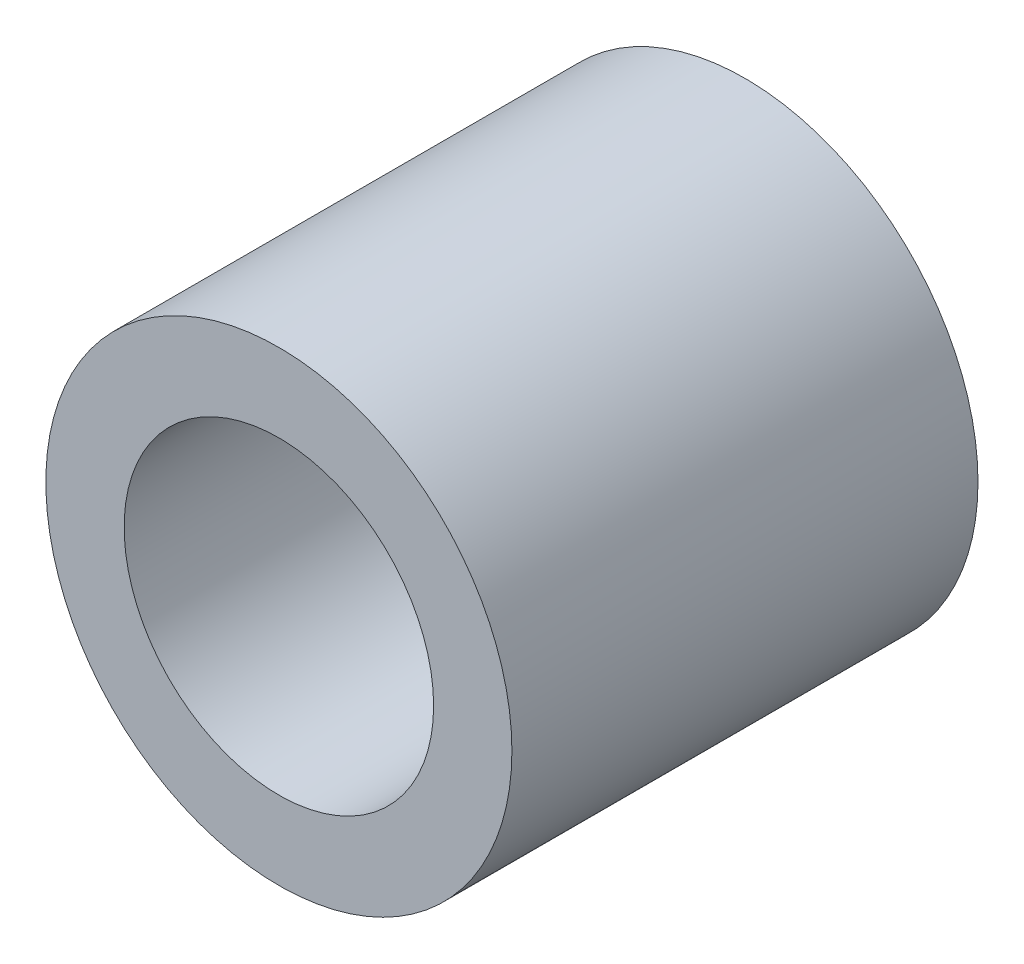
ISO-10303-21;
HEADER;
FILE_DESCRIPTION(('STEP AP214'),'2;1');
FILE_NAME('part.step','',(''),(''),'','','');
FILE_SCHEMA(('AUTOMOTIVE_DESIGN { 1 0 10303 214 1 1 1 1 }'));
ENDSEC;
DATA;
#1=APPLICATION_CONTEXT('core data for automotive mechanical design processes');
#2=APPLICATION_PROTOCOL_DEFINITION('international standard','automotive_design',2000,#1);
#3=PRODUCT_CONTEXT('',#1,'mechanical');
#4=PRODUCT('Part','Part','',(#3));
#5=PRODUCT_RELATED_PRODUCT_CATEGORY('part','',(#4));
#6=PRODUCT_DEFINITION_FORMATION('','',#4);
#7=PRODUCT_DEFINITION_CONTEXT('part definition',#1,'design');
#8=PRODUCT_DEFINITION('design','',#6,#7);
#9=PRODUCT_DEFINITION_SHAPE('','',#8);
#10=(LENGTH_UNIT() NAMED_UNIT(*) SI_UNIT(.MILLI.,.METRE.));
#11=(NAMED_UNIT(*) PLANE_ANGLE_UNIT() SI_UNIT($,.RADIAN.));
#12=(NAMED_UNIT(*) SI_UNIT($,.STERADIAN.) SOLID_ANGLE_UNIT());
#13=UNCERTAINTY_MEASURE_WITH_UNIT(LENGTH_MEASURE(1.E-05),#10,'distance_accuracy_value','');
#14=(GEOMETRIC_REPRESENTATION_CONTEXT(3) GLOBAL_UNCERTAINTY_ASSIGNED_CONTEXT((#13)) GLOBAL_UNIT_ASSIGNED_CONTEXT((#10,
#11,#12)) REPRESENTATION_CONTEXT('',''));
#15=CARTESIAN_POINT('',(0.,0.,0.));
#16=DIRECTION('',(0.,0.,1.));
#17=DIRECTION('',(1.,0.,0.));
#18=AXIS2_PLACEMENT_3D('',#15,#16,#17);
#19=CARTESIAN_POINT('',(0.,0.,3.175));
#20=DIRECTION('',(0.,0.,1.));
#21=DIRECTION('',(1.,0.,0.));
#22=AXIS2_PLACEMENT_3D('',#19,#20,#21);
#23=PLANE('',#22);
#24=CARTESIAN_POINT('',(0.,0.,3.175));
#25=DIRECTION('',(0.,0.,1.));
#26=DIRECTION('',(1.,0.,0.));
#27=AXIS2_PLACEMENT_3D('',#24,#25,#26);
#28=CIRCLE('',#27,3.175);
#29=CARTESIAN_POINT('',(3.175,0.,3.175));
#30=VERTEX_POINT('',#29);
#31=EDGE_CURVE('E10',#30,#30,#28,.T.);
#32=ORIENTED_EDGE('',*,*,#31,.T.);
#33=EDGE_LOOP('',(#32));
#34=FACE_BOUND('',#33,.T.);
#35=CARTESIAN_POINT('',(0.,0.,3.175));
#36=DIRECTION('',(0.,0.,1.));
#37=DIRECTION('',(1.,0.,0.));
#38=AXIS2_PLACEMENT_3D('',#35,#36,#37);
#39=CIRCLE('',#38,2.1082);
#40=CARTESIAN_POINT('',(2.1082,0.,3.175));
#41=VERTEX_POINT('',#40);
#42=EDGE_CURVE('E45',#41,#41,#39,.T.);
#43=ORIENTED_EDGE('',*,*,#42,.F.);
#44=EDGE_LOOP('',(#43));
#45=FACE_BOUND('',#44,.T.);
#46=ADVANCED_FACE('F34',(#34,#45),#23,.T.);
#47=CARTESIAN_POINT('',(0.,0.,-3.175));
#48=DIRECTION('',(0.,0.,1.));
#49=DIRECTION('',(1.,0.,0.));
#50=AXIS2_PLACEMENT_3D('',#47,#48,#49);
#51=PLANE('',#50);
#52=CARTESIAN_POINT('',(0.,0.,-3.175));
#53=DIRECTION('',(0.,0.,1.));
#54=DIRECTION('',(1.,0.,0.));
#55=AXIS2_PLACEMENT_3D('',#52,#53,#54);
#56=CIRCLE('',#55,3.175);
#57=CARTESIAN_POINT('',(3.175,0.,-3.175));
#58=VERTEX_POINT('',#57);
#59=EDGE_CURVE('E38',#58,#58,#56,.T.);
#60=ORIENTED_EDGE('',*,*,#59,.F.);
#61=EDGE_LOOP('',(#60));
#62=FACE_BOUND('',#61,.T.);
#63=CARTESIAN_POINT('',(0.,0.,-3.175));
#64=DIRECTION('',(0.,0.,1.));
#65=DIRECTION('',(1.,0.,0.));
#66=AXIS2_PLACEMENT_3D('',#63,#64,#65);
#67=CIRCLE('',#66,2.1082);
#68=CARTESIAN_POINT('',(2.1082,0.,-3.175));
#69=VERTEX_POINT('',#68);
#70=EDGE_CURVE('E47',#69,#69,#67,.T.);
#71=ORIENTED_EDGE('',*,*,#70,.T.);
#72=EDGE_LOOP('',(#71));
#73=FACE_BOUND('',#72,.T.);
#74=ADVANCED_FACE('F58',(#62,#73),#51,.F.);
#75=CARTESIAN_POINT('',(0.,0.,3.175));
#76=DIRECTION('',(0.,0.,-1.));
#77=DIRECTION('',(-1.,0.,0.));
#78=AXIS2_PLACEMENT_3D('',#75,#76,#77);
#79=CYLINDRICAL_SURFACE('',#78,3.175);
#80=ORIENTED_EDGE('',*,*,#31,.F.);
#81=EDGE_LOOP('',(#80));
#82=FACE_BOUND('',#81,.T.);
#83=ORIENTED_EDGE('',*,*,#59,.T.);
#84=EDGE_LOOP('',(#83));
#85=FACE_BOUND('',#84,.T.);
#86=ADVANCED_FACE('F36',(#82,#85),#79,.T.);
#87=CARTESIAN_POINT('',(0.,0.,3.175));
#88=DIRECTION('',(0.,0.,-1.));
#89=DIRECTION('',(-1.,0.,0.));
#90=AXIS2_PLACEMENT_3D('',#87,#88,#89);
#91=CYLINDRICAL_SURFACE('',#90,2.1082);
#92=ORIENTED_EDGE('',*,*,#42,.T.);
#93=EDGE_LOOP('',(#92));
#94=FACE_BOUND('',#93,.T.);
#95=ORIENTED_EDGE('',*,*,#70,.F.);
#96=EDGE_LOOP('',(#95));
#97=FACE_BOUND('',#96,.T.);
#98=ADVANCED_FACE('F54',(#94,#97),#91,.F.);
#99=CLOSED_SHELL('',(#46,#74,#86,#98));
#100=MANIFOLD_SOLID_BREP('B2',#99);
#101=ADVANCED_BREP_SHAPE_REPRESENTATION('',(#18,#100),#14);
#102=SHAPE_DEFINITION_REPRESENTATION(#9,#101);
ENDSEC;
END-ISO-10303-21;
